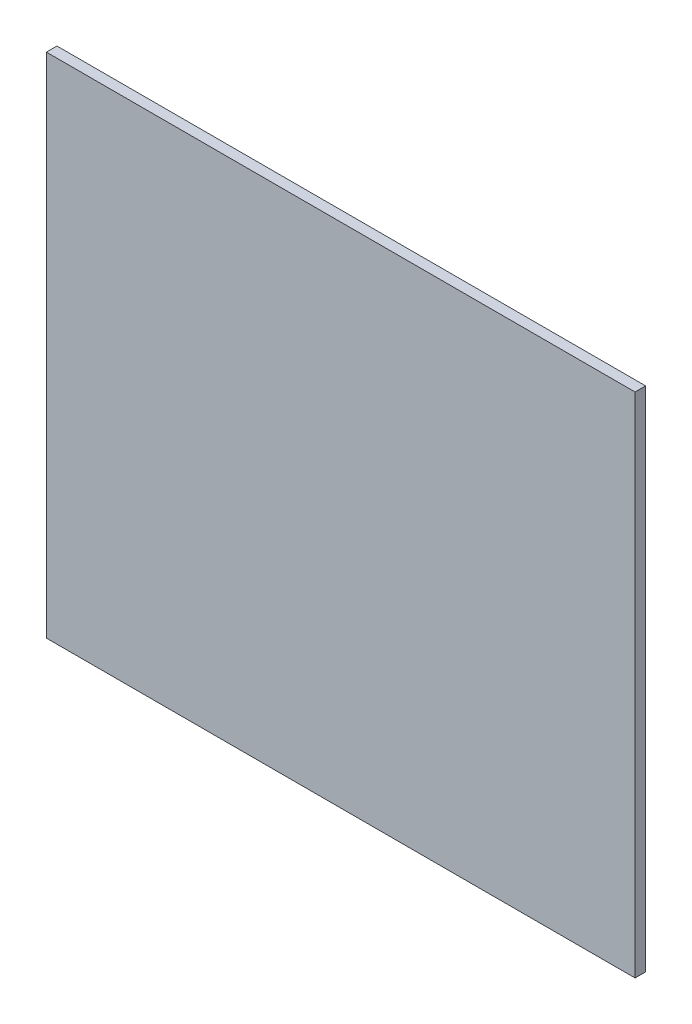
ISO-10303-21;
HEADER;
FILE_DESCRIPTION(('STEP AP214'),'2;1');
FILE_NAME('part.step','',(''),(''),'','','');
FILE_SCHEMA(('AUTOMOTIVE_DESIGN { 1 0 10303 214 1 1 1 1 }'));
ENDSEC;
DATA;
#1=APPLICATION_CONTEXT('core data for automotive mechanical design processes');
#2=APPLICATION_PROTOCOL_DEFINITION('international standard','automotive_design',2000,#1);
#3=PRODUCT_CONTEXT('',#1,'mechanical');
#4=PRODUCT('Part','Part','',(#3));
#5=PRODUCT_RELATED_PRODUCT_CATEGORY('part','',(#4));
#6=PRODUCT_DEFINITION_FORMATION('','',#4);
#7=PRODUCT_DEFINITION_CONTEXT('part definition',#1,'design');
#8=PRODUCT_DEFINITION('design','',#6,#7);
#9=PRODUCT_DEFINITION_SHAPE('','',#8);
#10=(LENGTH_UNIT() NAMED_UNIT(*) SI_UNIT(.MILLI.,.METRE.));
#11=(NAMED_UNIT(*) PLANE_ANGLE_UNIT() SI_UNIT($,.RADIAN.));
#12=(NAMED_UNIT(*) SI_UNIT($,.STERADIAN.) SOLID_ANGLE_UNIT());
#13=UNCERTAINTY_MEASURE_WITH_UNIT(LENGTH_MEASURE(1.E-05),#10,'distance_accuracy_value','');
#14=(GEOMETRIC_REPRESENTATION_CONTEXT(3) GLOBAL_UNCERTAINTY_ASSIGNED_CONTEXT((#13)) GLOBAL_UNIT_ASSIGNED_CONTEXT((#10,
#11,#12)) REPRESENTATION_CONTEXT('',''));
#15=CARTESIAN_POINT('',(0.,0.,0.));
#16=DIRECTION('',(0.,0.,1.));
#17=DIRECTION('',(1.,0.,0.));
#18=AXIS2_PLACEMENT_3D('',#15,#16,#17);
#19=CARTESIAN_POINT('',(0.,0.,3.175));
#20=DIRECTION('',(1.,0.,0.));
#21=DIRECTION('',(0.,0.,-1.));
#22=AXIS2_PLACEMENT_3D('',#19,#20,#21);
#23=PLANE('',#22);
#24=DIRECTION('',(0.,-1.,0.));
#25=VECTOR('',#24,1.);
#26=CARTESIAN_POINT('',(0.,0.,0.));
#27=LINE('',#26,#25);
#28=CARTESIAN_POINT('',(0.,152.4,0.));
#29=VERTEX_POINT('',#28);
#30=CARTESIAN_POINT('',(0.,0.,0.));
#31=VERTEX_POINT('',#30);
#32=EDGE_CURVE('E96',#29,#31,#27,.T.);
#33=ORIENTED_EDGE('',*,*,#32,.T.);
#34=DIRECTION('',(0.,0.,-1.));
#35=VECTOR('',#34,1.);
#36=CARTESIAN_POINT('',(0.,0.,3.175));
#37=LINE('',#36,#35);
#38=CARTESIAN_POINT('',(0.,0.,3.175));
#39=VERTEX_POINT('',#38);
#40=EDGE_CURVE('E11',#39,#31,#37,.T.);
#41=ORIENTED_EDGE('',*,*,#40,.F.);
#42=DIRECTION('',(0.,-1.,0.));
#43=VECTOR('',#42,1.);
#44=CARTESIAN_POINT('',(0.,0.,3.175));
#45=LINE('',#44,#43);
#46=CARTESIAN_POINT('',(0.,152.4,3.175));
#47=VERTEX_POINT('',#46);
#48=EDGE_CURVE('E84',#47,#39,#45,.T.);
#49=ORIENTED_EDGE('',*,*,#48,.F.);
#50=DIRECTION('',(0.,0.,-1.));
#51=VECTOR('',#50,1.);
#52=CARTESIAN_POINT('',(0.,152.4,3.175));
#53=LINE('',#52,#51);
#54=EDGE_CURVE('E92',#47,#29,#53,.T.);
#55=ORIENTED_EDGE('',*,*,#54,.T.);
#56=EDGE_LOOP('',(#33,#41,#49,#55));
#57=FACE_BOUND('',#56,.T.);
#58=ADVANCED_FACE('F33',(#57),#23,.F.);
#59=CARTESIAN_POINT('',(0.,0.,3.175));
#60=DIRECTION('',(0.,1.,0.));
#61=DIRECTION('',(0.,0.,1.));
#62=AXIS2_PLACEMENT_3D('',#59,#60,#61);
#63=PLANE('',#62);
#64=DIRECTION('',(1.,0.,0.));
#65=VECTOR('',#64,1.);
#66=CARTESIAN_POINT('',(0.,0.,0.));
#67=LINE('',#66,#65);
#68=CARTESIAN_POINT('',(176.784,0.,0.));
#69=VERTEX_POINT('',#68);
#70=EDGE_CURVE('E88',#31,#69,#67,.T.);
#71=ORIENTED_EDGE('',*,*,#70,.T.);
#72=DIRECTION('',(0.,0.,-1.));
#73=VECTOR('',#72,1.);
#74=CARTESIAN_POINT('',(176.784,0.,3.175));
#75=LINE('',#74,#73);
#76=CARTESIAN_POINT('',(176.784,0.,3.175));
#77=VERTEX_POINT('',#76);
#78=EDGE_CURVE('E41',#77,#69,#75,.T.);
#79=ORIENTED_EDGE('',*,*,#78,.F.);
#80=DIRECTION('',(1.,0.,0.));
#81=VECTOR('',#80,1.);
#82=CARTESIAN_POINT('',(0.,0.,3.175));
#83=LINE('',#82,#81);
#84=EDGE_CURVE('E79',#39,#77,#83,.T.);
#85=ORIENTED_EDGE('',*,*,#84,.F.);
#86=ORIENTED_EDGE('',*,*,#40,.T.);
#87=EDGE_LOOP('',(#71,#79,#85,#86));
#88=FACE_BOUND('',#87,.T.);
#89=ADVANCED_FACE('F87',(#88),#63,.F.);
#90=CARTESIAN_POINT('',(176.784,0.,3.175));
#91=DIRECTION('',(-1.,0.,0.));
#92=DIRECTION('',(0.,0.,1.));
#93=AXIS2_PLACEMENT_3D('',#90,#91,#92);
#94=PLANE('',#93);
#95=DIRECTION('',(0.,1.,0.));
#96=VECTOR('',#95,1.);
#97=CARTESIAN_POINT('',(176.784,0.,0.));
#98=LINE('',#97,#96);
#99=CARTESIAN_POINT('',(176.784,152.4,0.));
#100=VERTEX_POINT('',#99);
#101=EDGE_CURVE('E66',#69,#100,#98,.T.);
#102=ORIENTED_EDGE('',*,*,#101,.T.);
#103=DIRECTION('',(0.,0.,-1.));
#104=VECTOR('',#103,1.);
#105=CARTESIAN_POINT('',(176.784,152.4,3.175));
#106=LINE('',#105,#104);
#107=CARTESIAN_POINT('',(176.784,152.4,3.175));
#108=VERTEX_POINT('',#107);
#109=EDGE_CURVE('E89',#108,#100,#106,.T.);
#110=ORIENTED_EDGE('',*,*,#109,.F.);
#111=DIRECTION('',(0.,1.,0.));
#112=VECTOR('',#111,1.);
#113=CARTESIAN_POINT('',(176.784,0.,3.175));
#114=LINE('',#113,#112);
#115=EDGE_CURVE('E82',#77,#108,#114,.T.);
#116=ORIENTED_EDGE('',*,*,#115,.F.);
#117=ORIENTED_EDGE('',*,*,#78,.T.);
#118=EDGE_LOOP('',(#102,#110,#116,#117));
#119=FACE_BOUND('',#118,.T.);
#120=ADVANCED_FACE('F90',(#119),#94,.F.);
#121=CARTESIAN_POINT('',(0.,152.4,3.175));
#122=DIRECTION('',(0.,-1.,0.));
#123=DIRECTION('',(0.,0.,-1.));
#124=AXIS2_PLACEMENT_3D('',#121,#122,#123);
#125=PLANE('',#124);
#126=DIRECTION('',(-1.,0.,0.));
#127=VECTOR('',#126,1.);
#128=CARTESIAN_POINT('',(0.,152.4,0.));
#129=LINE('',#128,#127);
#130=EDGE_CURVE('E72',#100,#29,#129,.T.);
#131=ORIENTED_EDGE('',*,*,#130,.T.);
#132=ORIENTED_EDGE('',*,*,#54,.F.);
#133=DIRECTION('',(-1.,0.,0.));
#134=VECTOR('',#133,1.);
#135=CARTESIAN_POINT('',(0.,152.4,3.175));
#136=LINE('',#135,#134);
#137=EDGE_CURVE('E49',#108,#47,#136,.T.);
#138=ORIENTED_EDGE('',*,*,#137,.F.);
#139=ORIENTED_EDGE('',*,*,#109,.T.);
#140=EDGE_LOOP('',(#131,#132,#138,#139));
#141=FACE_BOUND('',#140,.T.);
#142=ADVANCED_FACE('F103',(#141),#125,.F.);
#143=CARTESIAN_POINT('',(0.,0.,3.175));
#144=DIRECTION('',(0.,0.,-1.));
#145=DIRECTION('',(-1.,0.,0.));
#146=AXIS2_PLACEMENT_3D('',#143,#144,#145);
#147=PLANE('',#146);
#148=ORIENTED_EDGE('',*,*,#48,.T.);
#149=ORIENTED_EDGE('',*,*,#84,.T.);
#150=ORIENTED_EDGE('',*,*,#115,.T.);
#151=ORIENTED_EDGE('',*,*,#137,.T.);
#152=EDGE_LOOP('',(#148,#149,#150,#151));
#153=FACE_BOUND('',#152,.T.);
#154=ADVANCED_FACE('F80',(#153),#147,.F.);
#155=CARTESIAN_POINT('',(0.,0.,0.));
#156=DIRECTION('',(0.,0.,-1.));
#157=DIRECTION('',(-1.,0.,0.));
#158=AXIS2_PLACEMENT_3D('',#155,#156,#157);
#159=PLANE('',#158);
#160=ORIENTED_EDGE('',*,*,#32,.F.);
#161=ORIENTED_EDGE('',*,*,#130,.F.);
#162=ORIENTED_EDGE('',*,*,#101,.F.);
#163=ORIENTED_EDGE('',*,*,#70,.F.);
#164=EDGE_LOOP('',(#160,#161,#162,#163));
#165=FACE_BOUND('',#164,.T.);
#166=ADVANCED_FACE('F106',(#165),#159,.T.);
#167=CLOSED_SHELL('',(#58,#89,#120,#142,#154,#166));
#168=MANIFOLD_SOLID_BREP('B2',#167);
#169=ADVANCED_BREP_SHAPE_REPRESENTATION('',(#18,#168),#14);
#170=SHAPE_DEFINITION_REPRESENTATION(#9,#169);
ENDSEC;
END-ISO-10303-21;
